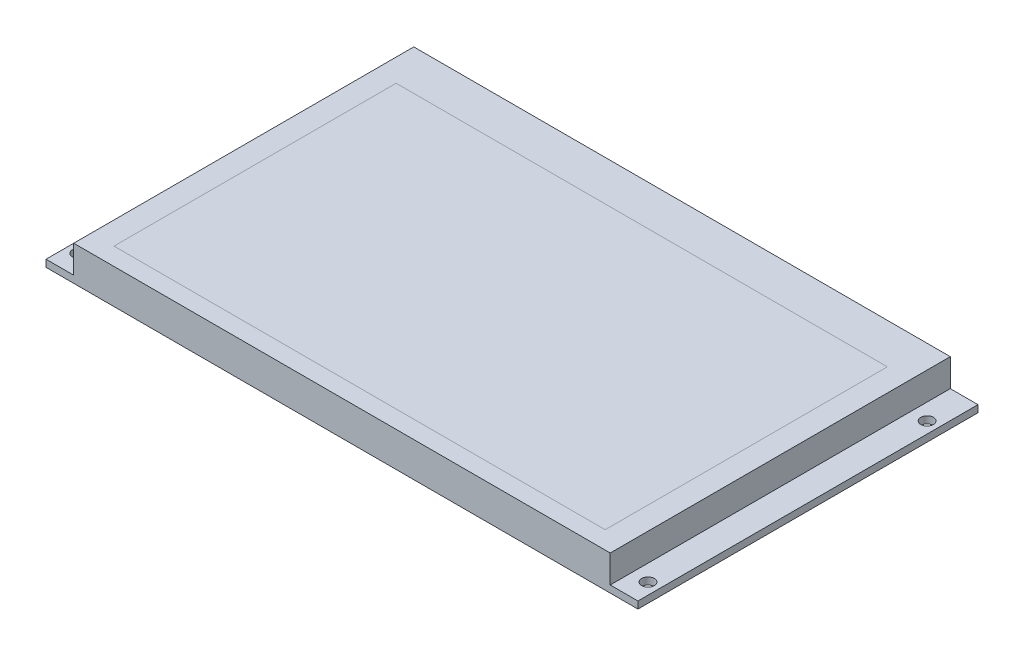
ISO-10303-21;
HEADER;
FILE_DESCRIPTION(('STEP AP214'),'2;1');
FILE_NAME('part.step','',(''),(''),'','','');
FILE_SCHEMA(('AUTOMOTIVE_DESIGN { 1 0 10303 214 1 1 1 1 }'));
ENDSEC;
DATA;
#1=APPLICATION_CONTEXT('core data for automotive mechanical design processes');
#2=APPLICATION_PROTOCOL_DEFINITION('international standard','automotive_design',2000,#1);
#3=PRODUCT_CONTEXT('',#1,'mechanical');
#4=PRODUCT('Part','Part','',(#3));
#5=PRODUCT_RELATED_PRODUCT_CATEGORY('part','',(#4));
#6=PRODUCT_DEFINITION_FORMATION('','',#4);
#7=PRODUCT_DEFINITION_CONTEXT('part definition',#1,'design');
#8=PRODUCT_DEFINITION('design','',#6,#7);
#9=PRODUCT_DEFINITION_SHAPE('','',#8);
#10=(LENGTH_UNIT() NAMED_UNIT(*) SI_UNIT(.MILLI.,.METRE.));
#11=(NAMED_UNIT(*) PLANE_ANGLE_UNIT() SI_UNIT($,.RADIAN.));
#12=(NAMED_UNIT(*) SI_UNIT($,.STERADIAN.) SOLID_ANGLE_UNIT());
#13=UNCERTAINTY_MEASURE_WITH_UNIT(LENGTH_MEASURE(1.E-05),#10,'distance_accuracy_value','');
#14=(GEOMETRIC_REPRESENTATION_CONTEXT(3) GLOBAL_UNCERTAINTY_ASSIGNED_CONTEXT((#13)) GLOBAL_UNIT_ASSIGNED_CONTEXT((#10,
#11,#12)) REPRESENTATION_CONTEXT('',''));
#15=CARTESIAN_POINT('',(0.,0.,0.));
#16=DIRECTION('',(0.,0.,1.));
#17=DIRECTION('',(1.,0.,0.));
#18=AXIS2_PLACEMENT_3D('',#15,#16,#17);
#19=CARTESIAN_POINT('',(0.,-2.,0.));
#20=DIRECTION('',(0.,-1.,0.));
#21=DIRECTION('',(0.,0.,-1.));
#22=AXIS2_PLACEMENT_3D('',#19,#20,#21);
#23=PLANE('',#22);
#24=DIRECTION('',(-1.,0.,0.));
#25=VECTOR('',#24,1.);
#26=CARTESIAN_POINT('',(0.,-2.,27.75));
#27=LINE('',#26,#25);
#28=CARTESIAN_POINT('',(23.75,-2.,27.75));
#29=VERTEX_POINT('',#28);
#30=CARTESIAN_POINT('',(-3.25000000000001,-2.,27.75));
#31=VERTEX_POINT('',#30);
#32=EDGE_CURVE('E48',#29,#31,#27,.T.);
#33=ORIENTED_EDGE('',*,*,#32,.T.);
#34=DIRECTION('',(0.,0.,1.));
#35=VECTOR('',#34,1.);
#36=CARTESIAN_POINT('',(-3.25000000000002,-2.,0.));
#37=LINE('',#36,#35);
#38=CARTESIAN_POINT('',(-3.25000000000001,-2.,30.25));
#39=VERTEX_POINT('',#38);
#40=EDGE_CURVE('E11',#31,#39,#37,.T.);
#41=ORIENTED_EDGE('',*,*,#40,.T.);
#42=DIRECTION('',(-1.,0.,0.));
#43=VECTOR('',#42,1.);
#44=CARTESIAN_POINT('',(-4.75000000000001,-2.,30.25));
#45=LINE('',#44,#43);
#46=CARTESIAN_POINT('',(-4.75000000000001,-2.,30.25));
#47=VERTEX_POINT('',#46);
#48=EDGE_CURVE('E162',#39,#47,#45,.T.);
#49=ORIENTED_EDGE('',*,*,#48,.T.);
#50=DIRECTION('',(0.,0.,-1.));
#51=VECTOR('',#50,1.);
#52=CARTESIAN_POINT('',(-4.75000000000001,-2.,30.25));
#53=LINE('',#52,#51);
#54=CARTESIAN_POINT('',(-4.75000000000001,-2.,24.25));
#55=VERTEX_POINT('',#54);
#56=EDGE_CURVE('E158',#47,#55,#53,.T.);
#57=ORIENTED_EDGE('',*,*,#56,.T.);
#58=DIRECTION('',(1.,0.,0.));
#59=VECTOR('',#58,1.);
#60=CARTESIAN_POINT('',(-4.75000000000001,-2.,24.25));
#61=LINE('',#60,#59);
#62=CARTESIAN_POINT('',(25.25,-2.,24.25));
#63=VERTEX_POINT('',#62);
#64=EDGE_CURVE('E147',#55,#63,#61,.T.);
#65=ORIENTED_EDGE('',*,*,#64,.T.);
#66=DIRECTION('',(0.,0.,1.));
#67=VECTOR('',#66,1.);
#68=CARTESIAN_POINT('',(25.25,-2.,30.25));
#69=LINE('',#68,#67);
#70=CARTESIAN_POINT('',(25.25,-2.,30.25));
#71=VERTEX_POINT('',#70);
#72=EDGE_CURVE('E157',#63,#71,#69,.T.);
#73=ORIENTED_EDGE('',*,*,#72,.T.);
#74=CARTESIAN_POINT('',(23.75,-2.,30.25));
#75=VERTEX_POINT('',#74);
#76=EDGE_CURVE('E282',#71,#75,#45,.T.);
#77=ORIENTED_EDGE('',*,*,#76,.T.);
#78=DIRECTION('',(0.,0.,-1.));
#79=VECTOR('',#78,1.);
#80=CARTESIAN_POINT('',(23.75,-2.,0.));
#81=LINE('',#80,#79);
#82=EDGE_CURVE('E275',#75,#29,#81,.T.);
#83=ORIENTED_EDGE('',*,*,#82,.T.);
#84=EDGE_LOOP('',(#33,#41,#49,#57,#65,#73,#77,#83));
#85=FACE_BOUND('',#84,.T.);
#86=ADVANCED_FACE('F39',(#85),#23,.T.);
#87=CARTESIAN_POINT('',(0.,0.,0.));
#88=DIRECTION('',(0.,-1.,0.));
#89=DIRECTION('',(0.,0.,-1.));
#90=AXIS2_PLACEMENT_3D('',#87,#88,#89);
#91=PLANE('',#90);
#92=CARTESIAN_POINT('',(56.5,0.,29.5));
#93=DIRECTION('',(0.,-1.,0.));
#94=DIRECTION('',(0.,0.,-1.));
#95=AXIS2_PLACEMENT_3D('',#92,#93,#94);
#96=CIRCLE('',#95,1.25);
#97=CARTESIAN_POINT('',(56.5,0.,28.25));
#98=VERTEX_POINT('',#97);
#99=EDGE_CURVE('E172',#98,#98,#96,.F.);
#100=ORIENTED_EDGE('',*,*,#99,.T.);
#101=EDGE_LOOP('',(#100));
#102=FACE_BOUND('',#101,.T.);
#103=CARTESIAN_POINT('',(56.5,0.,-25.9));
#104=DIRECTION('',(0.,-1.,0.));
#105=DIRECTION('',(0.,0.,-1.));
#106=AXIS2_PLACEMENT_3D('',#103,#104,#105);
#107=CIRCLE('',#106,1.25);
#108=CARTESIAN_POINT('',(56.5,0.,-27.15));
#109=VERTEX_POINT('',#108);
#110=EDGE_CURVE('E191',#109,#109,#107,.F.);
#111=ORIENTED_EDGE('',*,*,#110,.T.);
#112=EDGE_LOOP('',(#111));
#113=FACE_BOUND('',#112,.T.);
#114=CARTESIAN_POINT('',(-56.5,0.,-25.9));
#115=DIRECTION('',(0.,-1.,0.));
#116=DIRECTION('',(0.,0.,-1.));
#117=AXIS2_PLACEMENT_3D('',#114,#115,#116);
#118=CIRCLE('',#117,1.25);
#119=CARTESIAN_POINT('',(-56.5,0.,-27.15));
#120=VERTEX_POINT('',#119);
#121=EDGE_CURVE('E185',#120,#120,#118,.F.);
#122=ORIENTED_EDGE('',*,*,#121,.T.);
#123=EDGE_LOOP('',(#122));
#124=FACE_BOUND('',#123,.T.);
#125=CARTESIAN_POINT('',(-56.5,0.,29.5));
#126=DIRECTION('',(0.,-1.,0.));
#127=DIRECTION('',(0.,0.,-1.));
#128=AXIS2_PLACEMENT_3D('',#125,#126,#127);
#129=CIRCLE('',#128,1.25);
#130=CARTESIAN_POINT('',(-56.5,0.,28.25));
#131=VERTEX_POINT('',#130);
#132=EDGE_CURVE('E184',#131,#131,#129,.F.);
#133=ORIENTED_EDGE('',*,*,#132,.T.);
#134=EDGE_LOOP('',(#133));
#135=FACE_BOUND('',#134,.T.);
#136=DIRECTION('',(0.,0.,-1.));
#137=VECTOR('',#136,1.);
#138=CARTESIAN_POINT('',(58.75,0.,33.75));
#139=LINE('',#138,#137);
#140=CARTESIAN_POINT('',(58.75,0.,33.75));
#141=VERTEX_POINT('',#140);
#142=CARTESIAN_POINT('',(58.75,0.,-33.75));
#143=VERTEX_POINT('',#142);
#144=EDGE_CURVE('E228',#141,#143,#139,.T.);
#145=ORIENTED_EDGE('',*,*,#144,.F.);
#146=DIRECTION('',(1.,0.,0.));
#147=VECTOR('',#146,1.);
#148=CARTESIAN_POINT('',(-58.75,0.,33.75));
#149=LINE('',#148,#147);
#150=CARTESIAN_POINT('',(-58.75,0.,33.75));
#151=VERTEX_POINT('',#150);
#152=EDGE_CURVE('E233',#151,#141,#149,.T.);
#153=ORIENTED_EDGE('',*,*,#152,.F.);
#154=DIRECTION('',(0.,0.,1.));
#155=VECTOR('',#154,1.);
#156=CARTESIAN_POINT('',(-58.75,0.,33.75));
#157=LINE('',#156,#155);
#158=CARTESIAN_POINT('',(-58.75,0.,-33.75));
#159=VERTEX_POINT('',#158);
#160=EDGE_CURVE('E246',#159,#151,#157,.T.);
#161=ORIENTED_EDGE('',*,*,#160,.F.);
#162=DIRECTION('',(-1.,0.,0.));
#163=VECTOR('',#162,1.);
#164=CARTESIAN_POINT('',(-58.75,0.,-33.75));
#165=LINE('',#164,#163);
#166=EDGE_CURVE('E244',#143,#159,#165,.T.);
#167=ORIENTED_EDGE('',*,*,#166,.F.);
#168=EDGE_LOOP('',(#145,#153,#161,#167));
#169=FACE_BOUND('',#168,.T.);
#170=DIRECTION('',(1.,0.,0.));
#171=VECTOR('',#170,1.);
#172=CARTESIAN_POINT('',(-4.75000000000001,0.,24.25));
#173=LINE('',#172,#171);
#174=CARTESIAN_POINT('',(-4.75000000000001,0.,24.25));
#175=VERTEX_POINT('',#174);
#176=CARTESIAN_POINT('',(25.25,0.,24.25));
#177=VERTEX_POINT('',#176);
#178=EDGE_CURVE('E293',#175,#177,#173,.T.);
#179=ORIENTED_EDGE('',*,*,#178,.F.);
#180=DIRECTION('',(0.,0.,-1.));
#181=VECTOR('',#180,1.);
#182=CARTESIAN_POINT('',(-4.75000000000001,0.,30.25));
#183=LINE('',#182,#181);
#184=CARTESIAN_POINT('',(-4.75000000000001,0.,30.25));
#185=VERTEX_POINT('',#184);
#186=EDGE_CURVE('E170',#185,#175,#183,.T.);
#187=ORIENTED_EDGE('',*,*,#186,.F.);
#188=DIRECTION('',(-1.,0.,0.));
#189=VECTOR('',#188,1.);
#190=CARTESIAN_POINT('',(-4.75000000000001,0.,30.25));
#191=LINE('',#190,#189);
#192=CARTESIAN_POINT('',(25.25,0.,30.25));
#193=VERTEX_POINT('',#192);
#194=EDGE_CURVE('E166',#193,#185,#191,.T.);
#195=ORIENTED_EDGE('',*,*,#194,.F.);
#196=DIRECTION('',(0.,0.,1.));
#197=VECTOR('',#196,1.);
#198=CARTESIAN_POINT('',(25.25,0.,30.25));
#199=LINE('',#198,#197);
#200=EDGE_CURVE('E295',#177,#193,#199,.T.);
#201=ORIENTED_EDGE('',*,*,#200,.F.);
#202=EDGE_LOOP('',(#179,#187,#195,#201));
#203=FACE_BOUND('',#202,.T.);
#204=ADVANCED_FACE('F305',(#102,#113,#124,#135,#169,#203),#91,.T.);
#205=CARTESIAN_POINT('',(0.,6.9,0.));
#206=DIRECTION('',(0.,1.,0.));
#207=DIRECTION('',(0.,0.,1.));
#208=AXIS2_PLACEMENT_3D('',#205,#206,#207);
#209=PLANE('',#208);
#210=DIRECTION('',(0.,0.,1.));
#211=VECTOR('',#210,1.);
#212=CARTESIAN_POINT('',(-53.25,6.9,-33.75));
#213=LINE('',#212,#211);
#214=CARTESIAN_POINT('',(-53.25,6.9,-33.75));
#215=VERTEX_POINT('',#214);
#216=CARTESIAN_POINT('',(-53.25,6.9,33.75));
#217=VERTEX_POINT('',#216);
#218=EDGE_CURVE('E202',#215,#217,#213,.T.);
#219=ORIENTED_EDGE('',*,*,#218,.T.);
#220=DIRECTION('',(1.,0.,0.));
#221=VECTOR('',#220,1.);
#222=CARTESIAN_POINT('',(-53.25,6.9,33.75));
#223=LINE('',#222,#221);
#224=CARTESIAN_POINT('',(53.25,6.9,33.75));
#225=VERTEX_POINT('',#224);
#226=EDGE_CURVE('E205',#217,#225,#223,.T.);
#227=ORIENTED_EDGE('',*,*,#226,.T.);
#228=DIRECTION('',(0.,0.,-1.));
#229=VECTOR('',#228,1.);
#230=CARTESIAN_POINT('',(53.25,6.9,-33.75));
#231=LINE('',#230,#229);
#232=CARTESIAN_POINT('',(53.25,6.9,-33.75));
#233=VERTEX_POINT('',#232);
#234=EDGE_CURVE('E208',#225,#233,#231,.T.);
#235=ORIENTED_EDGE('',*,*,#234,.T.);
#236=DIRECTION('',(-1.,0.,0.));
#237=VECTOR('',#236,1.);
#238=CARTESIAN_POINT('',(-53.25,6.9,-33.75));
#239=LINE('',#238,#237);
#240=EDGE_CURVE('E210',#233,#215,#239,.T.);
#241=ORIENTED_EDGE('',*,*,#240,.T.);
#242=EDGE_LOOP('',(#219,#227,#235,#241));
#243=FACE_BOUND('',#242,.T.);
#244=DIRECTION('',(-1.,0.,0.));
#245=VECTOR('',#244,1.);
#246=CARTESIAN_POINT('',(0.,6.9,30.25));
#247=LINE('',#246,#245);
#248=CARTESIAN_POINT('',(48.75,6.9,30.25));
#249=VERTEX_POINT('',#248);
#250=CARTESIAN_POINT('',(-48.75,6.9,30.25));
#251=VERTEX_POINT('',#250);
#252=EDGE_CURVE('E268',#249,#251,#247,.T.);
#253=ORIENTED_EDGE('',*,*,#252,.T.);
#254=DIRECTION('',(0.,0.,-1.));
#255=VECTOR('',#254,1.);
#256=CARTESIAN_POINT('',(-48.75,6.9,0.));
#257=LINE('',#256,#255);
#258=CARTESIAN_POINT('',(-48.75,6.9,-25.75));
#259=VERTEX_POINT('',#258);
#260=EDGE_CURVE('E272',#251,#259,#257,.T.);
#261=ORIENTED_EDGE('',*,*,#260,.T.);
#262=DIRECTION('',(1.,0.,0.));
#263=VECTOR('',#262,1.);
#264=CARTESIAN_POINT('',(0.,6.9,-25.75));
#265=LINE('',#264,#263);
#266=CARTESIAN_POINT('',(48.75,6.9,-25.75));
#267=VERTEX_POINT('',#266);
#268=EDGE_CURVE('E260',#259,#267,#265,.T.);
#269=ORIENTED_EDGE('',*,*,#268,.T.);
#270=DIRECTION('',(0.,0.,1.));
#271=VECTOR('',#270,1.);
#272=CARTESIAN_POINT('',(48.75,6.9,0.));
#273=LINE('',#272,#271);
#274=EDGE_CURVE('E264',#267,#249,#273,.T.);
#275=ORIENTED_EDGE('',*,*,#274,.T.);
#276=EDGE_LOOP('',(#253,#261,#269,#275));
#277=FACE_BOUND('',#276,.T.);
#278=ADVANCED_FACE('F307',(#243,#277),#209,.T.);
#279=CARTESIAN_POINT('',(0.,1.4,0.));
#280=DIRECTION('',(0.,-1.,0.));
#281=DIRECTION('',(0.,0.,-1.));
#282=AXIS2_PLACEMENT_3D('',#279,#280,#281);
#283=PLANE('',#282);
#284=CARTESIAN_POINT('',(-56.5,1.4,-25.9));
#285=DIRECTION('',(0.,1.,0.));
#286=DIRECTION('',(0.,0.,1.));
#287=AXIS2_PLACEMENT_3D('',#284,#285,#286);
#288=CIRCLE('',#287,1.25);
#289=CARTESIAN_POINT('',(-56.5,1.4,-24.65));
#290=VERTEX_POINT('',#289);
#291=EDGE_CURVE('E181',#290,#290,#288,.T.);
#292=ORIENTED_EDGE('',*,*,#291,.F.);
#293=EDGE_LOOP('',(#292));
#294=FACE_BOUND('',#293,.T.);
#295=CARTESIAN_POINT('',(-56.5,1.4,29.5));
#296=DIRECTION('',(0.,1.,0.));
#297=DIRECTION('',(0.,0.,1.));
#298=AXIS2_PLACEMENT_3D('',#295,#296,#297);
#299=CIRCLE('',#298,1.25);
#300=CARTESIAN_POINT('',(-56.5,1.4,30.75));
#301=VERTEX_POINT('',#300);
#302=EDGE_CURVE('E196',#301,#301,#299,.T.);
#303=ORIENTED_EDGE('',*,*,#302,.F.);
#304=EDGE_LOOP('',(#303));
#305=FACE_BOUND('',#304,.T.);
#306=DIRECTION('',(0.,0.,1.));
#307=VECTOR('',#306,1.);
#308=CARTESIAN_POINT('',(-53.25,1.4,-33.75));
#309=LINE('',#308,#307);
#310=CARTESIAN_POINT('',(-53.25,1.4,-33.75));
#311=VERTEX_POINT('',#310);
#312=CARTESIAN_POINT('',(-53.25,1.4,33.75));
#313=VERTEX_POINT('',#312);
#314=EDGE_CURVE('E199',#311,#313,#309,.T.);
#315=ORIENTED_EDGE('',*,*,#314,.F.);
#316=DIRECTION('',(-1.,0.,0.));
#317=VECTOR('',#316,1.);
#318=CARTESIAN_POINT('',(-58.75,1.4,-33.75));
#319=LINE('',#318,#317);
#320=CARTESIAN_POINT('',(-58.75,1.4,-33.75));
#321=VERTEX_POINT('',#320);
#322=EDGE_CURVE('E232',#311,#321,#319,.T.);
#323=ORIENTED_EDGE('',*,*,#322,.T.);
#324=DIRECTION('',(0.,0.,1.));
#325=VECTOR('',#324,1.);
#326=CARTESIAN_POINT('',(-58.75,1.4,33.75));
#327=LINE('',#326,#325);
#328=CARTESIAN_POINT('',(-58.75,1.4,33.75));
#329=VERTEX_POINT('',#328);
#330=EDGE_CURVE('E236',#321,#329,#327,.T.);
#331=ORIENTED_EDGE('',*,*,#330,.T.);
#332=DIRECTION('',(1.,0.,0.));
#333=VECTOR('',#332,1.);
#334=CARTESIAN_POINT('',(-58.75,1.4,33.75));
#335=LINE('',#334,#333);
#336=EDGE_CURVE('E239',#329,#313,#335,.T.);
#337=ORIENTED_EDGE('',*,*,#336,.T.);
#338=EDGE_LOOP('',(#315,#323,#331,#337));
#339=FACE_BOUND('',#338,.T.);
#340=ADVANCED_FACE('F314',(#294,#305,#339),#283,.F.);
#341=CARTESIAN_POINT('',(56.5,1.4,29.5));
#342=DIRECTION('',(0.,1.,0.));
#343=DIRECTION('',(0.,0.,1.));
#344=AXIS2_PLACEMENT_3D('',#341,#342,#343);
#345=CIRCLE('',#344,1.25);
#346=CARTESIAN_POINT('',(56.5,1.4,30.75));
#347=VERTEX_POINT('',#346);
#348=EDGE_CURVE('E175',#347,#347,#345,.T.);
#349=ORIENTED_EDGE('',*,*,#348,.F.);
#350=EDGE_LOOP('',(#349));
#351=FACE_BOUND('',#350,.T.);
#352=CARTESIAN_POINT('',(56.5,1.4,-25.9));
#353=DIRECTION('',(0.,1.,0.));
#354=DIRECTION('',(0.,0.,1.));
#355=AXIS2_PLACEMENT_3D('',#352,#353,#354);
#356=CIRCLE('',#355,1.25);
#357=CARTESIAN_POINT('',(56.5,1.4,-24.65));
#358=VERTEX_POINT('',#357);
#359=EDGE_CURVE('E188',#358,#358,#356,.T.);
#360=ORIENTED_EDGE('',*,*,#359,.F.);
#361=EDGE_LOOP('',(#360));
#362=FACE_BOUND('',#361,.T.);
#363=DIRECTION('',(0.,0.,-1.));
#364=VECTOR('',#363,1.);
#365=CARTESIAN_POINT('',(53.25,1.4,-33.75));
#366=LINE('',#365,#364);
#367=CARTESIAN_POINT('',(53.25,1.4,33.75));
#368=VERTEX_POINT('',#367);
#369=CARTESIAN_POINT('',(53.25,1.4,-33.75));
#370=VERTEX_POINT('',#369);
#371=EDGE_CURVE('E206',#368,#370,#366,.T.);
#372=ORIENTED_EDGE('',*,*,#371,.F.);
#373=CARTESIAN_POINT('',(58.75,1.4,33.75));
#374=VERTEX_POINT('',#373);
#375=EDGE_CURVE('E238',#368,#374,#335,.T.);
#376=ORIENTED_EDGE('',*,*,#375,.T.);
#377=DIRECTION('',(0.,0.,-1.));
#378=VECTOR('',#377,1.);
#379=CARTESIAN_POINT('',(58.75,1.4,33.75));
#380=LINE('',#379,#378);
#381=CARTESIAN_POINT('',(58.75,1.4,-33.75));
#382=VERTEX_POINT('',#381);
#383=EDGE_CURVE('E229',#374,#382,#380,.T.);
#384=ORIENTED_EDGE('',*,*,#383,.T.);
#385=EDGE_CURVE('E234',#382,#370,#319,.T.);
#386=ORIENTED_EDGE('',*,*,#385,.T.);
#387=EDGE_LOOP('',(#372,#376,#384,#386));
#388=FACE_BOUND('',#387,.T.);
#389=ADVANCED_FACE('F337',(#351,#362,#388),#283,.F.);
#390=CARTESIAN_POINT('',(58.75,1.4,33.75));
#391=DIRECTION('',(-1.,0.,0.));
#392=DIRECTION('',(0.,0.,1.));
#393=AXIS2_PLACEMENT_3D('',#390,#391,#392);
#394=PLANE('',#393);
#395=ORIENTED_EDGE('',*,*,#144,.T.);
#396=DIRECTION('',(0.,-1.,0.));
#397=VECTOR('',#396,1.);
#398=CARTESIAN_POINT('',(58.75,1.4,-33.75));
#399=LINE('',#398,#397);
#400=EDGE_CURVE('E257',#382,#143,#399,.T.);
#401=ORIENTED_EDGE('',*,*,#400,.F.);
#402=ORIENTED_EDGE('',*,*,#383,.F.);
#403=DIRECTION('',(0.,-1.,0.));
#404=VECTOR('',#403,1.);
#405=CARTESIAN_POINT('',(58.75,1.4,33.75));
#406=LINE('',#405,#404);
#407=EDGE_CURVE('E241',#374,#141,#406,.T.);
#408=ORIENTED_EDGE('',*,*,#407,.T.);
#409=EDGE_LOOP('',(#395,#401,#402,#408));
#410=FACE_BOUND('',#409,.T.);
#411=ADVANCED_FACE('F41',(#410),#394,.F.);
#412=CARTESIAN_POINT('',(-58.75,1.4,-33.75));
#413=DIRECTION('',(0.,0.,1.));
#414=DIRECTION('',(1.,0.,0.));
#415=AXIS2_PLACEMENT_3D('',#412,#413,#414);
#416=PLANE('',#415);
#417=ORIENTED_EDGE('',*,*,#166,.T.);
#418=DIRECTION('',(0.,-1.,0.));
#419=VECTOR('',#418,1.);
#420=CARTESIAN_POINT('',(-58.75,1.4,-33.75));
#421=LINE('',#420,#419);
#422=EDGE_CURVE('E254',#321,#159,#421,.T.);
#423=ORIENTED_EDGE('',*,*,#422,.F.);
#424=ORIENTED_EDGE('',*,*,#322,.F.);
#425=DIRECTION('',(0.,-1.,0.));
#426=VECTOR('',#425,1.);
#427=CARTESIAN_POINT('',(-53.25,6.9,-33.75));
#428=LINE('',#427,#426);
#429=EDGE_CURVE('E212',#215,#311,#428,.T.);
#430=ORIENTED_EDGE('',*,*,#429,.F.);
#431=ORIENTED_EDGE('',*,*,#240,.F.);
#432=DIRECTION('',(0.,-1.,0.));
#433=VECTOR('',#432,1.);
#434=CARTESIAN_POINT('',(53.25,6.9,-33.75));
#435=LINE('',#434,#433);
#436=EDGE_CURVE('E219',#233,#370,#435,.T.);
#437=ORIENTED_EDGE('',*,*,#436,.T.);
#438=ORIENTED_EDGE('',*,*,#385,.F.);
#439=ORIENTED_EDGE('',*,*,#400,.T.);
#440=EDGE_LOOP('',(#417,#423,#424,#430,#431,#437,#438,#439));
#441=FACE_BOUND('',#440,.T.);
#442=ADVANCED_FACE('F330',(#441),#416,.F.);
#443=CARTESIAN_POINT('',(-58.75,1.4,33.75));
#444=DIRECTION('',(1.,0.,0.));
#445=DIRECTION('',(0.,0.,-1.));
#446=AXIS2_PLACEMENT_3D('',#443,#444,#445);
#447=PLANE('',#446);
#448=ORIENTED_EDGE('',*,*,#160,.T.);
#449=DIRECTION('',(0.,-1.,0.));
#450=VECTOR('',#449,1.);
#451=CARTESIAN_POINT('',(-58.75,1.4,33.75));
#452=LINE('',#451,#450);
#453=EDGE_CURVE('E251',#329,#151,#452,.T.);
#454=ORIENTED_EDGE('',*,*,#453,.F.);
#455=ORIENTED_EDGE('',*,*,#330,.F.);
#456=ORIENTED_EDGE('',*,*,#422,.T.);
#457=EDGE_LOOP('',(#448,#454,#455,#456));
#458=FACE_BOUND('',#457,.T.);
#459=ADVANCED_FACE('F327',(#458),#447,.F.);
#460=CARTESIAN_POINT('',(-58.75,1.4,33.75));
#461=DIRECTION('',(0.,0.,-1.));
#462=DIRECTION('',(-1.,0.,0.));
#463=AXIS2_PLACEMENT_3D('',#460,#461,#462);
#464=PLANE('',#463);
#465=ORIENTED_EDGE('',*,*,#152,.T.);
#466=ORIENTED_EDGE('',*,*,#407,.F.);
#467=ORIENTED_EDGE('',*,*,#375,.F.);
#468=DIRECTION('',(0.,-1.,0.));
#469=VECTOR('',#468,1.);
#470=CARTESIAN_POINT('',(53.25,6.9,33.75));
#471=LINE('',#470,#469);
#472=EDGE_CURVE('E222',#225,#368,#471,.T.);
#473=ORIENTED_EDGE('',*,*,#472,.F.);
#474=ORIENTED_EDGE('',*,*,#226,.F.);
#475=DIRECTION('',(0.,-1.,0.));
#476=VECTOR('',#475,1.);
#477=CARTESIAN_POINT('',(-53.25,6.9,33.75));
#478=LINE('',#477,#476);
#479=EDGE_CURVE('E225',#217,#313,#478,.T.);
#480=ORIENTED_EDGE('',*,*,#479,.T.);
#481=ORIENTED_EDGE('',*,*,#336,.F.);
#482=ORIENTED_EDGE('',*,*,#453,.T.);
#483=EDGE_LOOP('',(#465,#466,#467,#473,#474,#480,#481,#482));
#484=FACE_BOUND('',#483,.T.);
#485=ADVANCED_FACE('F323',(#484),#464,.F.);
#486=CARTESIAN_POINT('',(-53.25,6.9,-33.75));
#487=DIRECTION('',(1.,0.,0.));
#488=DIRECTION('',(0.,0.,-1.));
#489=AXIS2_PLACEMENT_3D('',#486,#487,#488);
#490=PLANE('',#489);
#491=ORIENTED_EDGE('',*,*,#314,.T.);
#492=ORIENTED_EDGE('',*,*,#479,.F.);
#493=ORIENTED_EDGE('',*,*,#218,.F.);
#494=ORIENTED_EDGE('',*,*,#429,.T.);
#495=EDGE_LOOP('',(#491,#492,#493,#494));
#496=FACE_BOUND('',#495,.T.);
#497=ADVANCED_FACE('F326',(#496),#490,.F.);
#498=CARTESIAN_POINT('',(53.25,6.9,-33.75));
#499=DIRECTION('',(-1.,0.,0.));
#500=DIRECTION('',(0.,0.,1.));
#501=AXIS2_PLACEMENT_3D('',#498,#499,#500);
#502=PLANE('',#501);
#503=ORIENTED_EDGE('',*,*,#371,.T.);
#504=ORIENTED_EDGE('',*,*,#436,.F.);
#505=ORIENTED_EDGE('',*,*,#234,.F.);
#506=ORIENTED_EDGE('',*,*,#472,.T.);
#507=EDGE_LOOP('',(#503,#504,#505,#506));
#508=FACE_BOUND('',#507,.T.);
#509=ADVANCED_FACE('F356',(#508),#502,.F.);
#510=ORIENTED_EDGE('',*,*,#260,.F.);
#511=ORIENTED_EDGE('',*,*,#252,.F.);
#512=ORIENTED_EDGE('',*,*,#274,.F.);
#513=ORIENTED_EDGE('',*,*,#268,.F.);
#514=EDGE_LOOP('',(#510,#511,#512,#513));
#515=FACE_BOUND('',#514,.T.);
#516=ADVANCED_FACE('F317',(#515),#209,.T.);
#517=CARTESIAN_POINT('',(-56.5,-0.000999999999999916,29.5));
#518=DIRECTION('',(0.,1.,0.));
#519=DIRECTION('',(0.,0.,1.));
#520=AXIS2_PLACEMENT_3D('',#517,#518,#519);
#521=CYLINDRICAL_SURFACE('',#520,1.25);
#522=ORIENTED_EDGE('',*,*,#132,.F.);
#523=EDGE_LOOP('',(#522));
#524=FACE_BOUND('',#523,.T.);
#525=ORIENTED_EDGE('',*,*,#302,.T.);
#526=EDGE_LOOP('',(#525));
#527=FACE_BOUND('',#526,.T.);
#528=ADVANCED_FACE('F375',(#524,#527),#521,.F.);
#529=CARTESIAN_POINT('',(-56.5,-0.000999999999999916,-25.9));
#530=DIRECTION('',(0.,1.,0.));
#531=DIRECTION('',(0.,0.,1.));
#532=AXIS2_PLACEMENT_3D('',#529,#530,#531);
#533=CYLINDRICAL_SURFACE('',#532,1.25);
#534=ORIENTED_EDGE('',*,*,#121,.F.);
#535=EDGE_LOOP('',(#534));
#536=FACE_BOUND('',#535,.T.);
#537=ORIENTED_EDGE('',*,*,#291,.T.);
#538=EDGE_LOOP('',(#537));
#539=FACE_BOUND('',#538,.T.);
#540=ADVANCED_FACE('F377',(#536,#539),#533,.F.);
#541=CARTESIAN_POINT('',(56.5,-0.000999999999999916,-25.9));
#542=DIRECTION('',(0.,1.,0.));
#543=DIRECTION('',(0.,0.,1.));
#544=AXIS2_PLACEMENT_3D('',#541,#542,#543);
#545=CYLINDRICAL_SURFACE('',#544,1.25);
#546=ORIENTED_EDGE('',*,*,#110,.F.);
#547=EDGE_LOOP('',(#546));
#548=FACE_BOUND('',#547,.T.);
#549=ORIENTED_EDGE('',*,*,#359,.T.);
#550=EDGE_LOOP('',(#549));
#551=FACE_BOUND('',#550,.T.);
#552=ADVANCED_FACE('F384',(#548,#551),#545,.F.);
#553=CARTESIAN_POINT('',(56.5,-0.000999999999999916,29.5));
#554=DIRECTION('',(0.,1.,0.));
#555=DIRECTION('',(0.,0.,1.));
#556=AXIS2_PLACEMENT_3D('',#553,#554,#555);
#557=CYLINDRICAL_SURFACE('',#556,1.25);
#558=ORIENTED_EDGE('',*,*,#99,.F.);
#559=EDGE_LOOP('',(#558));
#560=FACE_BOUND('',#559,.T.);
#561=ORIENTED_EDGE('',*,*,#348,.T.);
#562=EDGE_LOOP('',(#561));
#563=FACE_BOUND('',#562,.T.);
#564=ADVANCED_FACE('F390',(#560,#563),#557,.F.);
#565=CARTESIAN_POINT('',(-4.75000000000001,-2.,30.25));
#566=DIRECTION('',(1.,0.,0.));
#567=DIRECTION('',(0.,0.,-1.));
#568=AXIS2_PLACEMENT_3D('',#565,#566,#567);
#569=PLANE('',#568);
#570=ORIENTED_EDGE('',*,*,#186,.T.);
#571=DIRECTION('',(0.,1.,0.));
#572=VECTOR('',#571,1.);
#573=CARTESIAN_POINT('',(-4.75000000000001,-2.,24.25));
#574=LINE('',#573,#572);
#575=EDGE_CURVE('E151',#55,#175,#574,.T.);
#576=ORIENTED_EDGE('',*,*,#575,.F.);
#577=ORIENTED_EDGE('',*,*,#56,.F.);
#578=DIRECTION('',(0.,1.,0.));
#579=VECTOR('',#578,1.);
#580=CARTESIAN_POINT('',(-4.75000000000001,-2.,30.25));
#581=LINE('',#580,#579);
#582=EDGE_CURVE('E289',#47,#185,#581,.T.);
#583=ORIENTED_EDGE('',*,*,#582,.T.);
#584=EDGE_LOOP('',(#570,#576,#577,#583));
#585=FACE_BOUND('',#584,.T.);
#586=ADVANCED_FACE('F168',(#585),#569,.F.);
#587=CARTESIAN_POINT('',(-4.75000000000001,-2.,24.25));
#588=DIRECTION('',(0.,0.,1.));
#589=DIRECTION('',(1.,0.,0.));
#590=AXIS2_PLACEMENT_3D('',#587,#588,#589);
#591=PLANE('',#590);
#592=ORIENTED_EDGE('',*,*,#178,.T.);
#593=DIRECTION('',(0.,1.,0.));
#594=VECTOR('',#593,1.);
#595=CARTESIAN_POINT('',(25.25,-2.,24.25));
#596=LINE('',#595,#594);
#597=EDGE_CURVE('E154',#63,#177,#596,.T.);
#598=ORIENTED_EDGE('',*,*,#597,.F.);
#599=ORIENTED_EDGE('',*,*,#64,.F.);
#600=ORIENTED_EDGE('',*,*,#575,.T.);
#601=EDGE_LOOP('',(#592,#598,#599,#600));
#602=FACE_BOUND('',#601,.T.);
#603=ADVANCED_FACE('F149',(#602),#591,.F.);
#604=CARTESIAN_POINT('',(25.25,-2.,30.25));
#605=DIRECTION('',(-1.,0.,0.));
#606=DIRECTION('',(0.,0.,1.));
#607=AXIS2_PLACEMENT_3D('',#604,#605,#606);
#608=PLANE('',#607);
#609=ORIENTED_EDGE('',*,*,#200,.T.);
#610=DIRECTION('',(0.,1.,0.));
#611=VECTOR('',#610,1.);
#612=CARTESIAN_POINT('',(25.25,-2.,30.25));
#613=LINE('',#612,#611);
#614=EDGE_CURVE('E177',#71,#193,#613,.T.);
#615=ORIENTED_EDGE('',*,*,#614,.F.);
#616=ORIENTED_EDGE('',*,*,#72,.F.);
#617=ORIENTED_EDGE('',*,*,#597,.T.);
#618=EDGE_LOOP('',(#609,#615,#616,#617));
#619=FACE_BOUND('',#618,.T.);
#620=ADVANCED_FACE('F303',(#619),#608,.F.);
#621=CARTESIAN_POINT('',(-4.75000000000001,-2.,30.25));
#622=DIRECTION('',(0.,0.,-1.));
#623=DIRECTION('',(-1.,0.,0.));
#624=AXIS2_PLACEMENT_3D('',#621,#622,#623);
#625=PLANE('',#624);
#626=ORIENTED_EDGE('',*,*,#194,.T.);
#627=ORIENTED_EDGE('',*,*,#582,.F.);
#628=ORIENTED_EDGE('',*,*,#48,.F.);
#629=EDGE_CURVE('E285',#75,#39,#45,.T.);
#630=ORIENTED_EDGE('',*,*,#629,.F.);
#631=ORIENTED_EDGE('',*,*,#76,.F.);
#632=ORIENTED_EDGE('',*,*,#614,.T.);
#633=EDGE_LOOP('',(#626,#627,#628,#630,#631,#632));
#634=FACE_BOUND('',#633,.T.);
#635=ADVANCED_FACE('F287',(#634),#625,.F.);
#636=ORIENTED_EDGE('',*,*,#40,.F.);
#637=ORIENTED_EDGE('',*,*,#32,.F.);
#638=ORIENTED_EDGE('',*,*,#82,.F.);
#639=ORIENTED_EDGE('',*,*,#629,.T.);
#640=EDGE_LOOP('',(#636,#637,#638,#639));
#641=FACE_BOUND('',#640,.T.);
#642=ADVANCED_FACE('F284',(#641),#23,.T.);
#643=CLOSED_SHELL('',(#86,#204,#278,#340,#389,#411,#442,#459,#485,#497,#509,#516,#528,#540,#552,
#564,#586,#603,#620,#635,#642));
#644=MANIFOLD_SOLID_BREP('B2',#643);
#645=ADVANCED_BREP_SHAPE_REPRESENTATION('',(#18,#644),#14);
#646=SHAPE_DEFINITION_REPRESENTATION(#9,#645);
ENDSEC;
END-ISO-10303-21;
